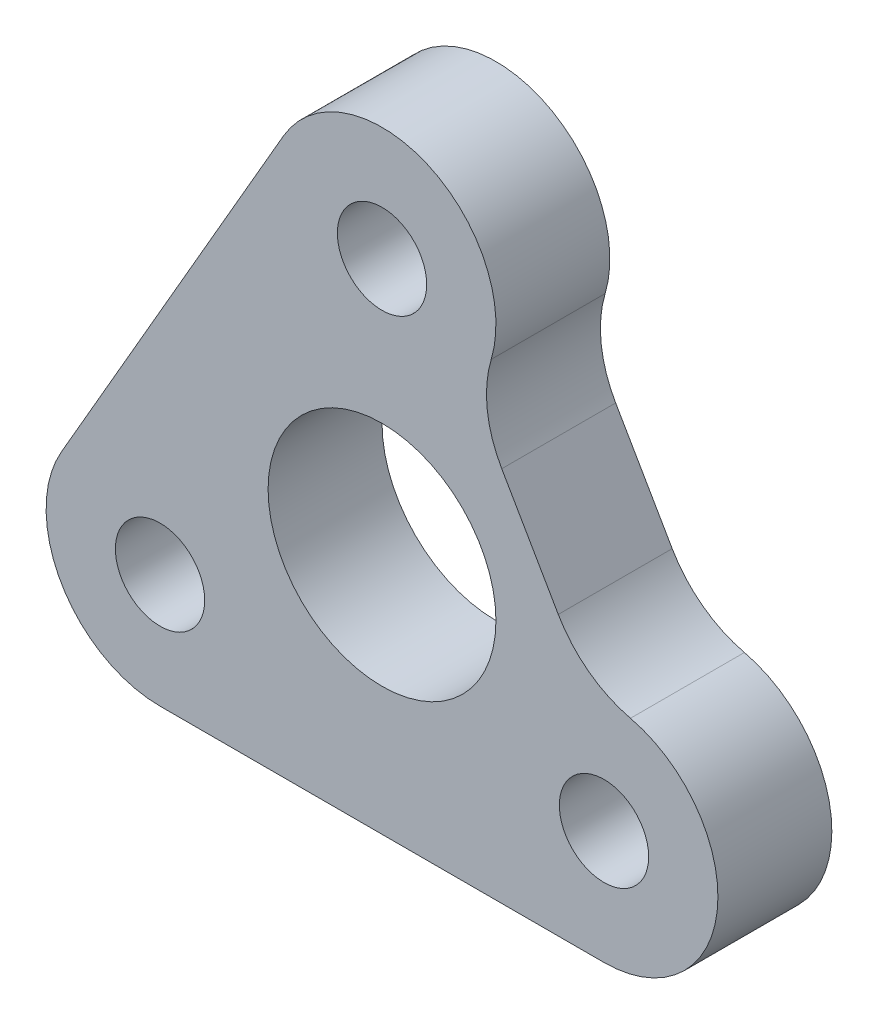
ISO-10303-21;
HEADER;
FILE_DESCRIPTION(('STEP AP214'),'2;1');
FILE_NAME('part.step','',(''),(''),'','','');
FILE_SCHEMA(('AUTOMOTIVE_DESIGN { 1 0 10303 214 1 1 1 1 }'));
ENDSEC;
DATA;
#1=APPLICATION_CONTEXT('core data for automotive mechanical design processes');
#2=APPLICATION_PROTOCOL_DEFINITION('international standard','automotive_design',2000,#1);
#3=PRODUCT_CONTEXT('',#1,'mechanical');
#4=PRODUCT('Part','Part','',(#3));
#5=PRODUCT_RELATED_PRODUCT_CATEGORY('part','',(#4));
#6=PRODUCT_DEFINITION_FORMATION('','',#4);
#7=PRODUCT_DEFINITION_CONTEXT('part definition',#1,'design');
#8=PRODUCT_DEFINITION('design','',#6,#7);
#9=PRODUCT_DEFINITION_SHAPE('','',#8);
#10=(LENGTH_UNIT() NAMED_UNIT(*) SI_UNIT(.MILLI.,.METRE.));
#11=(NAMED_UNIT(*) PLANE_ANGLE_UNIT() SI_UNIT($,.RADIAN.));
#12=(NAMED_UNIT(*) SI_UNIT($,.STERADIAN.) SOLID_ANGLE_UNIT());
#13=UNCERTAINTY_MEASURE_WITH_UNIT(LENGTH_MEASURE(1.E-05),#10,'distance_accuracy_value','');
#14=(GEOMETRIC_REPRESENTATION_CONTEXT(3) GLOBAL_UNCERTAINTY_ASSIGNED_CONTEXT((#13)) GLOBAL_UNIT_ASSIGNED_CONTEXT((#10,
#11,#12)) REPRESENTATION_CONTEXT('',''));
#15=CARTESIAN_POINT('',(0.,0.,0.));
#16=DIRECTION('',(0.,0.,1.));
#17=DIRECTION('',(1.,0.,0.));
#18=AXIS2_PLACEMENT_3D('',#15,#16,#17);
#19=CARTESIAN_POINT('',(0.,0.,6.35));
#20=DIRECTION('',(0.,0.,-1.));
#21=DIRECTION('',(-1.,0.,0.));
#22=AXIS2_PLACEMENT_3D('',#19,#20,#21);
#23=PLANE('',#22);
#24=CARTESIAN_POINT('',(-12.3733379565702,-7.14375000000001,6.35));
#25=DIRECTION('',(0.,0.,1.));
#26=DIRECTION('',(1.,0.,0.));
#27=AXIS2_PLACEMENT_3D('',#24,#25,#26);
#28=CIRCLE('',#27,2.4892);
#29=CARTESIAN_POINT('',(-9.88413795657016,-7.14375000000001,6.35));
#30=VERTEX_POINT('',#29);
#31=EDGE_CURVE('E206',#30,#30,#28,.T.);
#32=ORIENTED_EDGE('',*,*,#31,.F.);
#33=EDGE_LOOP('',(#32));
#34=FACE_BOUND('',#33,.T.);
#35=CARTESIAN_POINT('',(12.3733379565702,-7.14375,6.35));
#36=DIRECTION('',(0.,0.,1.));
#37=DIRECTION('',(1.,0.,0.));
#38=AXIS2_PLACEMENT_3D('',#35,#36,#37);
#39=CIRCLE('',#38,2.4892);
#40=CARTESIAN_POINT('',(14.8625379565702,-7.14375,6.35));
#41=VERTEX_POINT('',#40);
#42=EDGE_CURVE('E198',#41,#41,#39,.T.);
#43=ORIENTED_EDGE('',*,*,#42,.F.);
#44=EDGE_LOOP('',(#43));
#45=FACE_BOUND('',#44,.T.);
#46=CARTESIAN_POINT('',(0.,14.2875,6.35));
#47=DIRECTION('',(0.,0.,1.));
#48=DIRECTION('',(1.,0.,0.));
#49=AXIS2_PLACEMENT_3D('',#46,#47,#48);
#50=CIRCLE('',#49,2.4892);
#51=CARTESIAN_POINT('',(2.4892,14.2875,6.35));
#52=VERTEX_POINT('',#51);
#53=EDGE_CURVE('E192',#52,#52,#50,.T.);
#54=ORIENTED_EDGE('',*,*,#53,.F.);
#55=EDGE_LOOP('',(#54));
#56=FACE_BOUND('',#55,.T.);
#57=CARTESIAN_POINT('',(0.,0.,6.35));
#58=DIRECTION('',(0.,0.,1.));
#59=DIRECTION('',(1.,0.,0.));
#60=AXIS2_PLACEMENT_3D('',#57,#58,#59);
#61=CIRCLE('',#60,6.35);
#62=CARTESIAN_POINT('',(6.35,0.,6.35));
#63=VERTEX_POINT('',#62);
#64=EDGE_CURVE('E131',#63,#63,#61,.T.);
#65=ORIENTED_EDGE('',*,*,#64,.F.);
#66=EDGE_LOOP('',(#65));
#67=FACE_BOUND('',#66,.T.);
#68=CARTESIAN_POINT('',(12.3733379565702,-7.14375,6.35));
#69=DIRECTION('',(0.,0.,-1.));
#70=DIRECTION('',(-1.,0.,0.));
#71=AXIS2_PLACEMENT_3D('',#68,#69,#70);
#72=CIRCLE('',#71,6.35);
#73=CARTESIAN_POINT('',(12.3733379565702,-13.49375,6.35));
#74=VERTEX_POINT('',#73);
#75=CARTESIAN_POINT('',(13.8484447116775,-0.967459846433975,6.35));
#76=VERTEX_POINT('',#75);
#77=EDGE_CURVE('E125',#74,#76,#72,.F.);
#78=ORIENTED_EDGE('',*,*,#77,.T.);
#79=CARTESIAN_POINT('',(15.3235514667848,5.20883030713205,6.35));
#80=DIRECTION('',(0.,0.,-1.));
#81=DIRECTION('',(-1.,0.,0.));
#82=AXIS2_PLACEMENT_3D('',#79,#80,#81);
#83=CIRCLE('',#82,6.35);
#84=CARTESIAN_POINT('',(9.82429015275366,2.03383030713205,6.35));
#85=VERTEX_POINT('',#84);
#86=EDGE_CURVE('E179',#76,#85,#83,.T.);
#87=ORIENTED_EDGE('',*,*,#86,.T.);
#88=DIRECTION('',(0.5,-0.866025403784439,0.));
#89=VECTOR('',#88,1.);
#90=CARTESIAN_POINT('',(8.24889197104678,4.7625,6.35));
#91=LINE('',#90,#89);
#92=CARTESIAN_POINT('',(6.6734937893399,7.49116969286794,6.35));
#93=VERTEX_POINT('',#92);
#94=EDGE_CURVE('E218',#93,#85,#91,.T.);
#95=ORIENTED_EDGE('',*,*,#94,.F.);
#96=CARTESIAN_POINT('',(12.1727551033711,10.6661696928679,6.35));
#97=DIRECTION('',(0.,0.,-1.));
#98=DIRECTION('',(-1.,0.,0.));
#99=AXIS2_PLACEMENT_3D('',#96,#97,#98);
#100=CIRCLE('',#99,6.35);
#101=CARTESIAN_POINT('',(6.08637755168554,12.476834846434,6.35));
#102=VERTEX_POINT('',#101);
#103=EDGE_CURVE('E51',#93,#102,#100,.T.);
#104=ORIENTED_EDGE('',*,*,#103,.T.);
#105=CARTESIAN_POINT('',(0.,14.2875,6.35));
#106=DIRECTION('',(0.,0.,-1.));
#107=DIRECTION('',(-1.,0.,0.));
#108=AXIS2_PLACEMENT_3D('',#105,#106,#107);
#109=CIRCLE('',#108,6.35);
#110=CARTESIAN_POINT('',(-5.49926131403118,17.4625,6.35));
#111=VERTEX_POINT('',#110);
#112=EDGE_CURVE('E155',#102,#111,#109,.F.);
#113=ORIENTED_EDGE('',*,*,#112,.T.);
#114=DIRECTION('',(-0.5,-0.866025403784439,0.));
#115=VECTOR('',#114,1.);
#116=CARTESIAN_POINT('',(-23.3718605846325,-13.49375,6.35));
#117=LINE('',#116,#115);
#118=CARTESIAN_POINT('',(-17.8725992706013,-3.96875000000001,6.35));
#119=VERTEX_POINT('',#118);
#120=EDGE_CURVE('E122',#111,#119,#117,.T.);
#121=ORIENTED_EDGE('',*,*,#120,.T.);
#122=CARTESIAN_POINT('',(-12.3733379565702,-7.14375000000001,6.35));
#123=DIRECTION('',(0.,0.,-1.));
#124=DIRECTION('',(-1.,0.,0.));
#125=AXIS2_PLACEMENT_3D('',#122,#123,#124);
#126=CIRCLE('',#125,6.35);
#127=CARTESIAN_POINT('',(-12.3733379565702,-13.49375,6.35));
#128=VERTEX_POINT('',#127);
#129=EDGE_CURVE('E158',#119,#128,#126,.F.);
#130=ORIENTED_EDGE('',*,*,#129,.T.);
#131=DIRECTION('',(1.,0.,0.));
#132=VECTOR('',#131,1.);
#133=CARTESIAN_POINT('',(23.3718605846325,-13.49375,6.35));
#134=LINE('',#133,#132);
#135=EDGE_CURVE('E113',#128,#74,#134,.T.);
#136=ORIENTED_EDGE('',*,*,#135,.T.);
#137=EDGE_LOOP('',(#78,#87,#95,#104,#113,#121,#130,#136));
#138=FACE_BOUND('',#137,.T.);
#139=ADVANCED_FACE('F42',(#34,#45,#56,#67,#138),#23,.F.);
#140=CARTESIAN_POINT('',(0.,0.,0.));
#141=DIRECTION('',(0.,0.,-1.));
#142=DIRECTION('',(-1.,0.,0.));
#143=AXIS2_PLACEMENT_3D('',#140,#141,#142);
#144=PLANE('',#143);
#145=CARTESIAN_POINT('',(12.3733379565702,-7.14375,0.));
#146=DIRECTION('',(0.,0.,1.));
#147=DIRECTION('',(1.,0.,0.));
#148=AXIS2_PLACEMENT_3D('',#145,#146,#147);
#149=CIRCLE('',#148,2.4892);
#150=CARTESIAN_POINT('',(14.8625379565702,-7.14375,0.));
#151=VERTEX_POINT('',#150);
#152=EDGE_CURVE('E202',#151,#151,#149,.T.);
#153=ORIENTED_EDGE('',*,*,#152,.T.);
#154=EDGE_LOOP('',(#153));
#155=FACE_BOUND('',#154,.T.);
#156=CARTESIAN_POINT('',(0.,0.,0.));
#157=DIRECTION('',(0.,0.,1.));
#158=DIRECTION('',(1.,0.,0.));
#159=AXIS2_PLACEMENT_3D('',#156,#157,#158);
#160=CIRCLE('',#159,6.35);
#161=CARTESIAN_POINT('',(6.35,0.,0.));
#162=VERTEX_POINT('',#161);
#163=EDGE_CURVE('E138',#162,#162,#160,.T.);
#164=ORIENTED_EDGE('',*,*,#163,.T.);
#165=EDGE_LOOP('',(#164));
#166=FACE_BOUND('',#165,.T.);
#167=CARTESIAN_POINT('',(0.,14.2875,0.));
#168=DIRECTION('',(0.,0.,1.));
#169=DIRECTION('',(1.,0.,0.));
#170=AXIS2_PLACEMENT_3D('',#167,#168,#169);
#171=CIRCLE('',#170,2.4892);
#172=CARTESIAN_POINT('',(2.4892,14.2875,0.));
#173=VERTEX_POINT('',#172);
#174=EDGE_CURVE('E194',#173,#173,#171,.T.);
#175=ORIENTED_EDGE('',*,*,#174,.T.);
#176=EDGE_LOOP('',(#175));
#177=FACE_BOUND('',#176,.T.);
#178=CARTESIAN_POINT('',(-12.3733379565702,-7.14375000000001,0.));
#179=DIRECTION('',(0.,0.,1.));
#180=DIRECTION('',(1.,0.,0.));
#181=AXIS2_PLACEMENT_3D('',#178,#179,#180);
#182=CIRCLE('',#181,2.4892);
#183=CARTESIAN_POINT('',(-9.88413795657016,-7.14375000000001,0.));
#184=VERTEX_POINT('',#183);
#185=EDGE_CURVE('E210',#184,#184,#182,.T.);
#186=ORIENTED_EDGE('',*,*,#185,.T.);
#187=EDGE_LOOP('',(#186));
#188=FACE_BOUND('',#187,.T.);
#189=CARTESIAN_POINT('',(0.,14.2875,0.));
#190=DIRECTION('',(0.,0.,-1.));
#191=DIRECTION('',(-1.,0.,0.));
#192=AXIS2_PLACEMENT_3D('',#189,#190,#191);
#193=CIRCLE('',#192,6.35);
#194=CARTESIAN_POINT('',(-5.49926131403118,17.4625,0.));
#195=VERTEX_POINT('',#194);
#196=CARTESIAN_POINT('',(6.08637755168554,12.476834846434,0.));
#197=VERTEX_POINT('',#196);
#198=EDGE_CURVE('E104',#195,#197,#193,.T.);
#199=ORIENTED_EDGE('',*,*,#198,.T.);
#200=CARTESIAN_POINT('',(12.1727551033711,10.6661696928679,0.));
#201=DIRECTION('',(0.,0.,-1.));
#202=DIRECTION('',(-1.,0.,0.));
#203=AXIS2_PLACEMENT_3D('',#200,#201,#202);
#204=CIRCLE('',#203,6.35);
#205=CARTESIAN_POINT('',(6.6734937893399,7.49116969286794,0.));
#206=VERTEX_POINT('',#205);
#207=EDGE_CURVE('E11',#197,#206,#204,.F.);
#208=ORIENTED_EDGE('',*,*,#207,.T.);
#209=DIRECTION('',(0.5,-0.866025403784439,0.));
#210=VECTOR('',#209,1.);
#211=CARTESIAN_POINT('',(8.24889197104678,4.7625,0.));
#212=LINE('',#211,#210);
#213=CARTESIAN_POINT('',(9.82429015275366,2.03383030713205,0.));
#214=VERTEX_POINT('',#213);
#215=EDGE_CURVE('E214',#206,#214,#212,.T.);
#216=ORIENTED_EDGE('',*,*,#215,.T.);
#217=CARTESIAN_POINT('',(15.3235514667848,5.20883030713205,0.));
#218=DIRECTION('',(0.,0.,-1.));
#219=DIRECTION('',(-1.,0.,0.));
#220=AXIS2_PLACEMENT_3D('',#217,#218,#219);
#221=CIRCLE('',#220,6.35);
#222=CARTESIAN_POINT('',(13.8484447116775,-0.967459846433975,0.));
#223=VERTEX_POINT('',#222);
#224=EDGE_CURVE('E182',#214,#223,#221,.F.);
#225=ORIENTED_EDGE('',*,*,#224,.T.);
#226=CARTESIAN_POINT('',(12.3733379565702,-7.14375,0.));
#227=DIRECTION('',(0.,0.,-1.));
#228=DIRECTION('',(-1.,0.,0.));
#229=AXIS2_PLACEMENT_3D('',#226,#227,#228);
#230=CIRCLE('',#229,6.35);
#231=CARTESIAN_POINT('',(12.3733379565702,-13.49375,0.));
#232=VERTEX_POINT('',#231);
#233=EDGE_CURVE('E145',#223,#232,#230,.T.);
#234=ORIENTED_EDGE('',*,*,#233,.T.);
#235=DIRECTION('',(1.,0.,0.));
#236=VECTOR('',#235,1.);
#237=CARTESIAN_POINT('',(23.3718605846325,-13.49375,0.));
#238=LINE('',#237,#236);
#239=CARTESIAN_POINT('',(-12.3733379565702,-13.49375,0.));
#240=VERTEX_POINT('',#239);
#241=EDGE_CURVE('E130',#240,#232,#238,.T.);
#242=ORIENTED_EDGE('',*,*,#241,.F.);
#243=CARTESIAN_POINT('',(-12.3733379565702,-7.14375000000001,0.));
#244=DIRECTION('',(0.,0.,-1.));
#245=DIRECTION('',(-1.,0.,0.));
#246=AXIS2_PLACEMENT_3D('',#243,#244,#245);
#247=CIRCLE('',#246,6.35);
#248=CARTESIAN_POINT('',(-17.8725992706013,-3.96875000000001,0.));
#249=VERTEX_POINT('',#248);
#250=EDGE_CURVE('E112',#240,#249,#247,.T.);
#251=ORIENTED_EDGE('',*,*,#250,.T.);
#252=DIRECTION('',(-0.5,-0.866025403784439,0.));
#253=VECTOR('',#252,1.);
#254=CARTESIAN_POINT('',(-23.3718605846325,-13.49375,0.));
#255=LINE('',#254,#253);
#256=EDGE_CURVE('E119',#195,#249,#255,.T.);
#257=ORIENTED_EDGE('',*,*,#256,.F.);
#258=EDGE_LOOP('',(#199,#208,#216,#225,#234,#242,#251,#257));
#259=FACE_BOUND('',#258,.T.);
#260=ADVANCED_FACE('F127',(#155,#166,#177,#188,#259),#144,.T.);
#261=CARTESIAN_POINT('',(-23.3718605846325,-13.49375,6.35));
#262=DIRECTION('',(0.866025403784439,-0.5,0.));
#263=DIRECTION('',(0.5,0.866025403784439,0.));
#264=AXIS2_PLACEMENT_3D('',#261,#262,#263);
#265=PLANE('',#264);
#266=ORIENTED_EDGE('',*,*,#256,.T.);
#267=DIRECTION('',(0.,0.,-1.));
#268=VECTOR('',#267,1.);
#269=CARTESIAN_POINT('',(-17.8725992706013,-3.96875000000001,6.35));
#270=LINE('',#269,#268);
#271=EDGE_CURVE('E124',#249,#119,#270,.F.);
#272=ORIENTED_EDGE('',*,*,#271,.T.);
#273=ORIENTED_EDGE('',*,*,#120,.F.);
#274=DIRECTION('',(0.,0.,-1.));
#275=VECTOR('',#274,1.);
#276=CARTESIAN_POINT('',(-5.49926131403118,17.4625,6.35));
#277=LINE('',#276,#275);
#278=EDGE_CURVE('E107',#111,#195,#277,.T.);
#279=ORIENTED_EDGE('',*,*,#278,.T.);
#280=EDGE_LOOP('',(#266,#272,#273,#279));
#281=FACE_BOUND('',#280,.T.);
#282=ADVANCED_FACE('F118',(#281),#265,.F.);
#283=CARTESIAN_POINT('',(23.3718605846325,-13.49375,6.35));
#284=DIRECTION('',(0.,1.,0.));
#285=DIRECTION('',(0.,0.,1.));
#286=AXIS2_PLACEMENT_3D('',#283,#284,#285);
#287=PLANE('',#286);
#288=ORIENTED_EDGE('',*,*,#241,.T.);
#289=DIRECTION('',(0.,0.,-1.));
#290=VECTOR('',#289,1.);
#291=CARTESIAN_POINT('',(12.3733379565702,-13.49375,6.35));
#292=LINE('',#291,#290);
#293=EDGE_CURVE('E152',#232,#74,#292,.F.);
#294=ORIENTED_EDGE('',*,*,#293,.T.);
#295=ORIENTED_EDGE('',*,*,#135,.F.);
#296=DIRECTION('',(0.,0.,-1.));
#297=VECTOR('',#296,1.);
#298=CARTESIAN_POINT('',(-12.3733379565702,-13.49375,6.35));
#299=LINE('',#298,#297);
#300=EDGE_CURVE('E148',#128,#240,#299,.T.);
#301=ORIENTED_EDGE('',*,*,#300,.T.);
#302=EDGE_LOOP('',(#288,#294,#295,#301));
#303=FACE_BOUND('',#302,.T.);
#304=ADVANCED_FACE('F240',(#303),#287,.F.);
#305=CARTESIAN_POINT('',(0.,0.,6.35));
#306=DIRECTION('',(0.,0.,-1.));
#307=DIRECTION('',(-1.,0.,0.));
#308=AXIS2_PLACEMENT_3D('',#305,#306,#307);
#309=CYLINDRICAL_SURFACE('',#308,6.35);
#310=ORIENTED_EDGE('',*,*,#64,.T.);
#311=EDGE_LOOP('',(#310));
#312=FACE_BOUND('',#311,.T.);
#313=ORIENTED_EDGE('',*,*,#163,.F.);
#314=EDGE_LOOP('',(#313));
#315=FACE_BOUND('',#314,.T.);
#316=ADVANCED_FACE('F266',(#312,#315),#309,.F.);
#317=CARTESIAN_POINT('',(0.,14.2875,6.35));
#318=DIRECTION('',(0.,0.,-1.));
#319=DIRECTION('',(-1.,0.,0.));
#320=AXIS2_PLACEMENT_3D('',#317,#318,#319);
#321=CYLINDRICAL_SURFACE('',#320,2.4892);
#322=ORIENTED_EDGE('',*,*,#53,.T.);
#323=EDGE_LOOP('',(#322));
#324=FACE_BOUND('',#323,.T.);
#325=ORIENTED_EDGE('',*,*,#174,.F.);
#326=EDGE_LOOP('',(#325));
#327=FACE_BOUND('',#326,.T.);
#328=ADVANCED_FACE('F285',(#324,#327),#321,.F.);
#329=CARTESIAN_POINT('',(12.3733379565702,-7.14375,6.35));
#330=DIRECTION('',(0.,0.,-1.));
#331=DIRECTION('',(-1.,0.,0.));
#332=AXIS2_PLACEMENT_3D('',#329,#330,#331);
#333=CYLINDRICAL_SURFACE('',#332,2.4892);
#334=ORIENTED_EDGE('',*,*,#42,.T.);
#335=EDGE_LOOP('',(#334));
#336=FACE_BOUND('',#335,.T.);
#337=ORIENTED_EDGE('',*,*,#152,.F.);
#338=EDGE_LOOP('',(#337));
#339=FACE_BOUND('',#338,.T.);
#340=ADVANCED_FACE('F292',(#336,#339),#333,.F.);
#341=CARTESIAN_POINT('',(-12.3733379565702,-7.14375000000001,6.35));
#342=DIRECTION('',(0.,0.,-1.));
#343=DIRECTION('',(-1.,0.,0.));
#344=AXIS2_PLACEMENT_3D('',#341,#342,#343);
#345=CYLINDRICAL_SURFACE('',#344,2.4892);
#346=ORIENTED_EDGE('',*,*,#31,.T.);
#347=EDGE_LOOP('',(#346));
#348=FACE_BOUND('',#347,.T.);
#349=ORIENTED_EDGE('',*,*,#185,.F.);
#350=EDGE_LOOP('',(#349));
#351=FACE_BOUND('',#350,.T.);
#352=ADVANCED_FACE('F253',(#348,#351),#345,.F.);
#353=CARTESIAN_POINT('',(12.3733379565702,-7.14375,6.35));
#354=DIRECTION('',(0.,0.,-1.));
#355=DIRECTION('',(-1.,0.,0.));
#356=AXIS2_PLACEMENT_3D('',#353,#354,#355);
#357=CYLINDRICAL_SURFACE('',#356,6.35);
#358=ORIENTED_EDGE('',*,*,#233,.F.);
#359=DIRECTION('',(0.,0.,-1.));
#360=VECTOR('',#359,1.);
#361=CARTESIAN_POINT('',(13.8484447116775,-0.967459846433975,6.35));
#362=LINE('',#361,#360);
#363=EDGE_CURVE('E166',#223,#76,#362,.F.);
#364=ORIENTED_EDGE('',*,*,#363,.T.);
#365=ORIENTED_EDGE('',*,*,#77,.F.);
#366=ORIENTED_EDGE('',*,*,#293,.F.);
#367=EDGE_LOOP('',(#358,#364,#365,#366));
#368=FACE_BOUND('',#367,.T.);
#369=ADVANCED_FACE('F235',(#368),#357,.T.);
#370=CARTESIAN_POINT('',(-12.3733379565702,-7.14375000000001,6.35));
#371=DIRECTION('',(0.,0.,-1.));
#372=DIRECTION('',(-1.,0.,0.));
#373=AXIS2_PLACEMENT_3D('',#370,#371,#372);
#374=CYLINDRICAL_SURFACE('',#373,6.35);
#375=ORIENTED_EDGE('',*,*,#129,.F.);
#376=ORIENTED_EDGE('',*,*,#271,.F.);
#377=ORIENTED_EDGE('',*,*,#250,.F.);
#378=ORIENTED_EDGE('',*,*,#300,.F.);
#379=EDGE_LOOP('',(#375,#376,#377,#378));
#380=FACE_BOUND('',#379,.T.);
#381=ADVANCED_FACE('F242',(#380),#374,.T.);
#382=CARTESIAN_POINT('',(0.,14.2875,6.35));
#383=DIRECTION('',(0.,0.,-1.));
#384=DIRECTION('',(-1.,0.,0.));
#385=AXIS2_PLACEMENT_3D('',#382,#383,#384);
#386=CYLINDRICAL_SURFACE('',#385,6.35);
#387=ORIENTED_EDGE('',*,*,#112,.F.);
#388=DIRECTION('',(0.,0.,-1.));
#389=VECTOR('',#388,1.);
#390=CARTESIAN_POINT('',(6.08637755168554,12.476834846434,6.35));
#391=LINE('',#390,#389);
#392=EDGE_CURVE('E58',#102,#197,#391,.T.);
#393=ORIENTED_EDGE('',*,*,#392,.T.);
#394=ORIENTED_EDGE('',*,*,#198,.F.);
#395=ORIENTED_EDGE('',*,*,#278,.F.);
#396=EDGE_LOOP('',(#387,#393,#394,#395));
#397=FACE_BOUND('',#396,.T.);
#398=ADVANCED_FACE('F106',(#397),#386,.T.);
#399=CARTESIAN_POINT('',(8.24889197104678,4.7625,0.));
#400=DIRECTION('',(-0.866025403784439,-0.5,0.));
#401=DIRECTION('',(0.5,-0.866025403784439,0.));
#402=AXIS2_PLACEMENT_3D('',#399,#400,#401);
#403=PLANE('',#402);
#404=ORIENTED_EDGE('',*,*,#94,.T.);
#405=DIRECTION('',(0.,0.,-1.));
#406=VECTOR('',#405,1.);
#407=CARTESIAN_POINT('',(9.82429015275366,2.03383030713205,0.));
#408=LINE('',#407,#406);
#409=EDGE_CURVE('E174',#85,#214,#408,.T.);
#410=ORIENTED_EDGE('',*,*,#409,.T.);
#411=ORIENTED_EDGE('',*,*,#215,.F.);
#412=DIRECTION('',(0.,0.,-1.));
#413=VECTOR('',#412,1.);
#414=CARTESIAN_POINT('',(6.6734937893399,7.49116969286794,0.));
#415=LINE('',#414,#413);
#416=EDGE_CURVE('E170',#206,#93,#415,.F.);
#417=ORIENTED_EDGE('',*,*,#416,.T.);
#418=EDGE_LOOP('',(#404,#410,#411,#417));
#419=FACE_BOUND('',#418,.T.);
#420=ADVANCED_FACE('F250',(#419),#403,.F.);
#421=CARTESIAN_POINT('',(15.3235514667848,5.20883030713205,6.35));
#422=DIRECTION('',(0.,0.,-1.));
#423=DIRECTION('',(-1.,0.,0.));
#424=AXIS2_PLACEMENT_3D('',#421,#422,#423);
#425=CYLINDRICAL_SURFACE('',#424,6.35);
#426=ORIENTED_EDGE('',*,*,#224,.F.);
#427=ORIENTED_EDGE('',*,*,#409,.F.);
#428=ORIENTED_EDGE('',*,*,#86,.F.);
#429=ORIENTED_EDGE('',*,*,#363,.F.);
#430=EDGE_LOOP('',(#426,#427,#428,#429));
#431=FACE_BOUND('',#430,.T.);
#432=ADVANCED_FACE('F232',(#431),#425,.F.);
#433=CARTESIAN_POINT('',(12.1727551033711,10.6661696928679,6.35));
#434=DIRECTION('',(0.,0.,-1.));
#435=DIRECTION('',(-1.,0.,0.));
#436=AXIS2_PLACEMENT_3D('',#433,#434,#435);
#437=CYLINDRICAL_SURFACE('',#436,6.35);
#438=ORIENTED_EDGE('',*,*,#207,.F.);
#439=ORIENTED_EDGE('',*,*,#392,.F.);
#440=ORIENTED_EDGE('',*,*,#103,.F.);
#441=ORIENTED_EDGE('',*,*,#416,.F.);
#442=EDGE_LOOP('',(#438,#439,#440,#441));
#443=FACE_BOUND('',#442,.T.);
#444=ADVANCED_FACE('F44',(#443),#437,.F.);
#445=CLOSED_SHELL('',(#139,#260,#282,#304,#316,#328,#340,#352,#369,#381,#398,#420,#432,#444));
#446=MANIFOLD_SOLID_BREP('B2',#445);
#447=ADVANCED_BREP_SHAPE_REPRESENTATION('',(#18,#446),#14);
#448=SHAPE_DEFINITION_REPRESENTATION(#9,#447);
ENDSEC;
END-ISO-10303-21;
